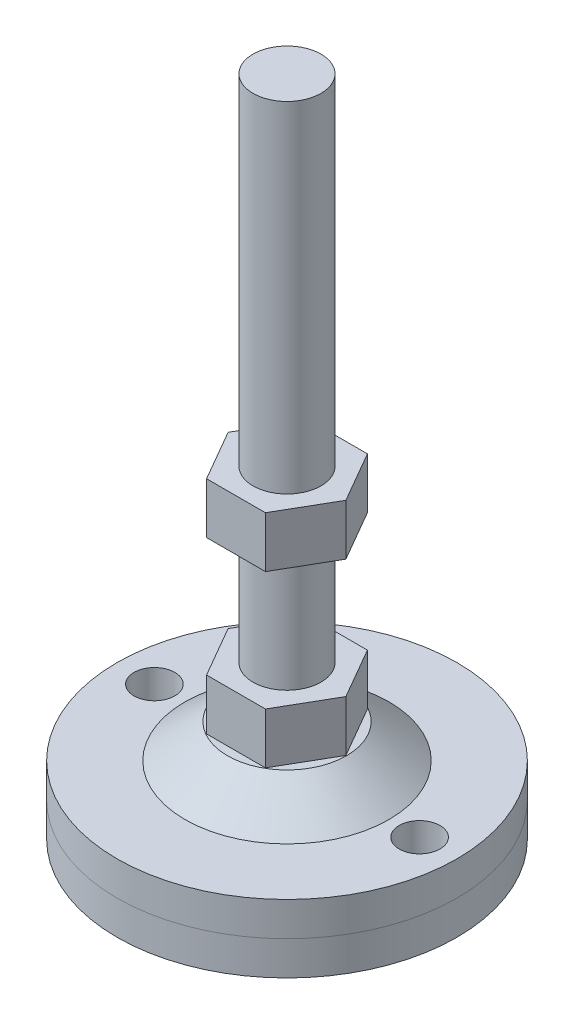
ISO-10303-21;
HEADER;
FILE_DESCRIPTION(('STEP AP214'),'2;1');
FILE_NAME('part.step','',(''),(''),'','','');
FILE_SCHEMA(('AUTOMOTIVE_DESIGN { 1 0 10303 214 1 1 1 1 }'));
ENDSEC;
DATA;
#1=APPLICATION_CONTEXT('core data for automotive mechanical design processes');
#2=APPLICATION_PROTOCOL_DEFINITION('international standard','automotive_design',2000,#1);
#3=PRODUCT_CONTEXT('',#1,'mechanical');
#4=PRODUCT('Part','Part','',(#3));
#5=PRODUCT_RELATED_PRODUCT_CATEGORY('part','',(#4));
#6=PRODUCT_DEFINITION_FORMATION('','',#4);
#7=PRODUCT_DEFINITION_CONTEXT('part definition',#1,'design');
#8=PRODUCT_DEFINITION('design','',#6,#7);
#9=PRODUCT_DEFINITION_SHAPE('','',#8);
#10=(LENGTH_UNIT() NAMED_UNIT(*) SI_UNIT(.MILLI.,.METRE.));
#11=(NAMED_UNIT(*) PLANE_ANGLE_UNIT() SI_UNIT($,.RADIAN.));
#12=(NAMED_UNIT(*) SI_UNIT($,.STERADIAN.) SOLID_ANGLE_UNIT());
#13=UNCERTAINTY_MEASURE_WITH_UNIT(LENGTH_MEASURE(1.E-05),#10,'distance_accuracy_value','');
#14=(GEOMETRIC_REPRESENTATION_CONTEXT(3) GLOBAL_UNCERTAINTY_ASSIGNED_CONTEXT((#13)) GLOBAL_UNIT_ASSIGNED_CONTEXT((#10,
#11,#12)) REPRESENTATION_CONTEXT('',''));
#15=CARTESIAN_POINT('',(0.,0.,0.));
#16=DIRECTION('',(0.,0.,1.));
#17=DIRECTION('',(1.,0.,0.));
#18=AXIS2_PLACEMENT_3D('',#15,#16,#17);
#19=CARTESIAN_POINT('',(0.,165.,0.));
#20=DIRECTION('',(0.,1.,0.));
#21=DIRECTION('',(0.,0.,1.));
#22=AXIS2_PLACEMENT_3D('',#19,#20,#21);
#23=PLANE('',#22);
#24=CARTESIAN_POINT('',(0.,165.,0.));
#25=DIRECTION('',(0.,-1.,0.));
#26=DIRECTION('',(0.,0.,-1.));
#27=AXIS2_PLACEMENT_3D('',#24,#25,#26);
#28=CIRCLE('',#27,10.);
#29=CARTESIAN_POINT('',(0.,165.,-10.));
#30=VERTEX_POINT('',#29);
#31=EDGE_CURVE('P0_E20',#30,#30,#28,.T.);
#32=ORIENTED_EDGE('',*,*,#31,.F.);
#33=EDGE_LOOP('',(#32));
#34=FACE_BOUND('',#33,.T.);
#35=ADVANCED_FACE('P0_F17',(#34),#23,.T.);
#36=CARTESIAN_POINT('',(0.,165.,0.));
#37=DIRECTION('',(0.,-1.,0.));
#38=DIRECTION('',(0.,0.,-1.));
#39=AXIS2_PLACEMENT_3D('',#36,#37,#38);
#40=CYLINDRICAL_SURFACE('',#39,10.);
#41=CARTESIAN_POINT('',(0.,65.,0.));
#42=DIRECTION('',(0.,-1.,0.));
#43=DIRECTION('',(0.,0.,-1.));
#44=AXIS2_PLACEMENT_3D('',#41,#42,#43);
#45=CIRCLE('',#44,10.);
#46=CARTESIAN_POINT('',(0.,65.,-10.));
#47=VERTEX_POINT('',#46);
#48=EDGE_CURVE('P0_E116',#47,#47,#45,.T.);
#49=ORIENTED_EDGE('',*,*,#48,.F.);
#50=EDGE_LOOP('',(#49));
#51=FACE_BOUND('',#50,.T.);
#52=ORIENTED_EDGE('',*,*,#31,.T.);
#53=EDGE_LOOP('',(#52));
#54=FACE_BOUND('',#53,.T.);
#55=ADVANCED_FACE('P0_F167',(#51,#54),#40,.T.);
#56=CARTESIAN_POINT('',(0.,65.,0.));
#57=DIRECTION('',(0.,1.,0.));
#58=DIRECTION('',(0.,0.,1.));
#59=AXIS2_PLACEMENT_3D('',#56,#57,#58);
#60=PLANE('',#59);
#61=DIRECTION('',(-0.5,0.,-0.866025403784439));
#62=VECTOR('',#61,1.);
#63=CARTESIAN_POINT('',(-17.3205080756888,65.,0.));
#64=LINE('',#63,#62);
#65=CARTESIAN_POINT('',(-17.3205080756888,65.,0.));
#66=VERTEX_POINT('',#65);
#67=CARTESIAN_POINT('',(-8.66025403784439,65.,15.));
#68=VERTEX_POINT('',#67);
#69=EDGE_CURVE('P0_E428',#66,#68,#64,.F.);
#70=ORIENTED_EDGE('',*,*,#69,.T.);
#71=DIRECTION('',(-1.,0.,0.));
#72=VECTOR('',#71,1.);
#73=CARTESIAN_POINT('',(-8.66025403784439,65.,15.));
#74=LINE('',#73,#72);
#75=CARTESIAN_POINT('',(8.66025403784439,65.,15.));
#76=VERTEX_POINT('',#75);
#77=EDGE_CURVE('P0_E435',#68,#76,#74,.F.);
#78=ORIENTED_EDGE('',*,*,#77,.T.);
#79=DIRECTION('',(-0.5,0.,0.866025403784439));
#80=VECTOR('',#79,1.);
#81=CARTESIAN_POINT('',(8.66025403784439,65.,15.));
#82=LINE('',#81,#80);
#83=CARTESIAN_POINT('',(17.3205080756888,65.,0.));
#84=VERTEX_POINT('',#83);
#85=EDGE_CURVE('P0_E112',#76,#84,#82,.F.);
#86=ORIENTED_EDGE('',*,*,#85,.T.);
#87=DIRECTION('',(0.5,0.,0.866025403784439));
#88=VECTOR('',#87,1.);
#89=CARTESIAN_POINT('',(17.3205080756888,65.,0.));
#90=LINE('',#89,#88);
#91=CARTESIAN_POINT('',(8.66025403784438,65.,-15.));
#92=VERTEX_POINT('',#91);
#93=EDGE_CURVE('P0_E107',#84,#92,#90,.F.);
#94=ORIENTED_EDGE('',*,*,#93,.T.);
#95=DIRECTION('',(1.,0.,0.));
#96=VECTOR('',#95,1.);
#97=CARTESIAN_POINT('',(8.66025403784438,65.,-15.));
#98=LINE('',#97,#96);
#99=CARTESIAN_POINT('',(-8.66025403784439,65.,-15.));
#100=VERTEX_POINT('',#99);
#101=EDGE_CURVE('P0_E104',#92,#100,#98,.F.);
#102=ORIENTED_EDGE('',*,*,#101,.T.);
#103=DIRECTION('',(0.5,0.,-0.866025403784439));
#104=VECTOR('',#103,1.);
#105=CARTESIAN_POINT('',(-8.66025403784439,65.,-15.));
#106=LINE('',#105,#104);
#107=EDGE_CURVE('P0_E130',#100,#66,#106,.F.);
#108=ORIENTED_EDGE('',*,*,#107,.T.);
#109=EDGE_LOOP('',(#70,#78,#86,#94,#102,#108));
#110=FACE_BOUND('',#109,.T.);
#111=ORIENTED_EDGE('',*,*,#48,.T.);
#112=EDGE_LOOP('',(#111));
#113=FACE_BOUND('',#112,.T.);
#114=ADVANCED_FACE('P0_F109',(#110,#113),#60,.T.);
#115=CARTESIAN_POINT('',(17.3205080756888,65.,0.));
#116=DIRECTION('',(-0.866025403784439,0.,0.5));
#117=DIRECTION('',(0.5,0.,0.866025403784439));
#118=AXIS2_PLACEMENT_3D('',#115,#116,#117);
#119=PLANE('',#118);
#120=DIRECTION('',(0.,1.,0.));
#121=VECTOR('',#120,1.);
#122=CARTESIAN_POINT('',(8.66025403784438,65.,-15.));
#123=LINE('',#122,#121);
#124=CARTESIAN_POINT('',(8.66025403784438,50.,-15.));
#125=VERTEX_POINT('',#124);
#126=EDGE_CURVE('P0_E115',#125,#92,#123,.T.);
#127=ORIENTED_EDGE('',*,*,#126,.T.);
#128=ORIENTED_EDGE('',*,*,#93,.F.);
#129=DIRECTION('',(0.,1.,0.));
#130=VECTOR('',#129,1.);
#131=CARTESIAN_POINT('',(17.3205080756888,65.,0.));
#132=LINE('',#131,#130);
#133=CARTESIAN_POINT('',(17.3205080756888,50.,0.));
#134=VERTEX_POINT('',#133);
#135=EDGE_CURVE('P0_E443',#84,#134,#132,.F.);
#136=ORIENTED_EDGE('',*,*,#135,.T.);
#137=DIRECTION('',(-0.5,0.,-0.866025403784439));
#138=VECTOR('',#137,1.);
#139=CARTESIAN_POINT('',(17.3205080756888,50.,0.));
#140=LINE('',#139,#138);
#141=EDGE_CURVE('P0_E121',#134,#125,#140,.T.);
#142=ORIENTED_EDGE('',*,*,#141,.T.);
#143=EDGE_LOOP('',(#127,#128,#136,#142));
#144=FACE_BOUND('',#143,.T.);
#145=ADVANCED_FACE('P0_F119',(#144),#119,.F.);
#146=CARTESIAN_POINT('',(8.66025403784438,65.,-15.));
#147=DIRECTION('',(0.,0.,1.));
#148=DIRECTION('',(1.,0.,0.));
#149=AXIS2_PLACEMENT_3D('',#146,#147,#148);
#150=PLANE('',#149);
#151=DIRECTION('',(0.,1.,0.));
#152=VECTOR('',#151,1.);
#153=CARTESIAN_POINT('',(-8.66025403784439,65.,-15.));
#154=LINE('',#153,#152);
#155=CARTESIAN_POINT('',(-8.66025403784439,50.,-15.));
#156=VERTEX_POINT('',#155);
#157=EDGE_CURVE('P0_E127',#156,#100,#154,.T.);
#158=ORIENTED_EDGE('',*,*,#157,.T.);
#159=ORIENTED_EDGE('',*,*,#101,.F.);
#160=ORIENTED_EDGE('',*,*,#126,.F.);
#161=DIRECTION('',(1.,0.,0.));
#162=VECTOR('',#161,1.);
#163=CARTESIAN_POINT('',(0.,50.,-15.));
#164=LINE('',#163,#162);
#165=EDGE_CURVE('P0_E446',#125,#156,#164,.F.);
#166=ORIENTED_EDGE('',*,*,#165,.T.);
#167=EDGE_LOOP('',(#158,#159,#160,#166));
#168=FACE_BOUND('',#167,.T.);
#169=ADVANCED_FACE('P0_F125',(#168),#150,.F.);
#170=CARTESIAN_POINT('',(-8.66025403784439,65.,-15.));
#171=DIRECTION('',(0.866025403784439,0.,0.5));
#172=DIRECTION('',(0.5,0.,-0.866025403784439));
#173=AXIS2_PLACEMENT_3D('',#170,#171,#172);
#174=PLANE('',#173);
#175=DIRECTION('',(0.,1.,0.));
#176=VECTOR('',#175,1.);
#177=CARTESIAN_POINT('',(-17.3205080756888,65.,0.));
#178=LINE('',#177,#176);
#179=CARTESIAN_POINT('',(-17.3205080756888,50.,0.));
#180=VERTEX_POINT('',#179);
#181=EDGE_CURVE('P0_E423',#180,#66,#178,.T.);
#182=ORIENTED_EDGE('',*,*,#181,.T.);
#183=ORIENTED_EDGE('',*,*,#107,.F.);
#184=ORIENTED_EDGE('',*,*,#157,.F.);
#185=DIRECTION('',(-0.5,0.,0.866025403784439));
#186=VECTOR('',#185,1.);
#187=CARTESIAN_POINT('',(-8.66025403784439,50.,-15.));
#188=LINE('',#187,#186);
#189=EDGE_CURVE('P0_E426',#156,#180,#188,.T.);
#190=ORIENTED_EDGE('',*,*,#189,.T.);
#191=EDGE_LOOP('',(#182,#183,#184,#190));
#192=FACE_BOUND('',#191,.T.);
#193=ADVANCED_FACE('P0_F253',(#192),#174,.F.);
#194=CARTESIAN_POINT('',(-17.3205080756888,65.,0.));
#195=DIRECTION('',(0.866025403784439,0.,-0.5));
#196=DIRECTION('',(-0.5,0.,-0.866025403784439));
#197=AXIS2_PLACEMENT_3D('',#194,#195,#196);
#198=PLANE('',#197);
#199=DIRECTION('',(0.,1.,0.));
#200=VECTOR('',#199,1.);
#201=CARTESIAN_POINT('',(-8.66025403784439,65.,15.));
#202=LINE('',#201,#200);
#203=CARTESIAN_POINT('',(-8.66025403784439,50.,15.));
#204=VERTEX_POINT('',#203);
#205=EDGE_CURVE('P0_E432',#204,#68,#202,.T.);
#206=ORIENTED_EDGE('',*,*,#205,.T.);
#207=ORIENTED_EDGE('',*,*,#69,.F.);
#208=ORIENTED_EDGE('',*,*,#181,.F.);
#209=DIRECTION('',(0.5,0.,0.866025403784439));
#210=VECTOR('',#209,1.);
#211=CARTESIAN_POINT('',(-17.3205080756888,50.,0.));
#212=LINE('',#211,#210);
#213=EDGE_CURVE('P0_E449',#180,#204,#212,.T.);
#214=ORIENTED_EDGE('',*,*,#213,.T.);
#215=EDGE_LOOP('',(#206,#207,#208,#214));
#216=FACE_BOUND('',#215,.T.);
#217=ADVANCED_FACE('P0_F249',(#216),#198,.F.);
#218=CARTESIAN_POINT('',(-8.66025403784439,65.,15.));
#219=DIRECTION('',(0.,0.,-1.));
#220=DIRECTION('',(-1.,0.,0.));
#221=AXIS2_PLACEMENT_3D('',#218,#219,#220);
#222=PLANE('',#221);
#223=DIRECTION('',(0.,1.,0.));
#224=VECTOR('',#223,1.);
#225=CARTESIAN_POINT('',(8.66025403784439,65.,15.));
#226=LINE('',#225,#224);
#227=CARTESIAN_POINT('',(8.66025403784439,50.,15.));
#228=VERTEX_POINT('',#227);
#229=EDGE_CURVE('P0_E439',#228,#76,#226,.T.);
#230=ORIENTED_EDGE('',*,*,#229,.T.);
#231=ORIENTED_EDGE('',*,*,#77,.F.);
#232=ORIENTED_EDGE('',*,*,#205,.F.);
#233=DIRECTION('',(1.,0.,0.));
#234=VECTOR('',#233,1.);
#235=CARTESIAN_POINT('',(0.,50.,15.));
#236=LINE('',#235,#234);
#237=EDGE_CURVE('P0_E451',#204,#228,#236,.T.);
#238=ORIENTED_EDGE('',*,*,#237,.T.);
#239=EDGE_LOOP('',(#230,#231,#232,#238));
#240=FACE_BOUND('',#239,.T.);
#241=ADVANCED_FACE('P0_F245',(#240),#222,.F.);
#242=CARTESIAN_POINT('',(8.66025403784439,65.,15.));
#243=DIRECTION('',(-0.866025403784439,0.,-0.5));
#244=DIRECTION('',(-0.5,0.,0.866025403784439));
#245=AXIS2_PLACEMENT_3D('',#242,#243,#244);
#246=PLANE('',#245);
#247=ORIENTED_EDGE('',*,*,#135,.F.);
#248=ORIENTED_EDGE('',*,*,#85,.F.);
#249=ORIENTED_EDGE('',*,*,#229,.F.);
#250=DIRECTION('',(0.5,0.,-0.866025403784439));
#251=VECTOR('',#250,1.);
#252=CARTESIAN_POINT('',(8.66025403784439,50.,15.));
#253=LINE('',#252,#251);
#254=EDGE_CURVE('P0_E161',#228,#134,#253,.T.);
#255=ORIENTED_EDGE('',*,*,#254,.T.);
#256=EDGE_LOOP('',(#247,#248,#249,#255));
#257=FACE_BOUND('',#256,.T.);
#258=ADVANCED_FACE('P0_F241',(#257),#246,.F.);
#259=CARTESIAN_POINT('',(0.,50.,0.));
#260=DIRECTION('',(0.,1.,0.));
#261=DIRECTION('',(0.,0.,1.));
#262=AXIS2_PLACEMENT_3D('',#259,#260,#261);
#263=PLANE('',#262);
#264=ORIENTED_EDGE('',*,*,#237,.F.);
#265=ORIENTED_EDGE('',*,*,#213,.F.);
#266=ORIENTED_EDGE('',*,*,#189,.F.);
#267=ORIENTED_EDGE('',*,*,#165,.F.);
#268=ORIENTED_EDGE('',*,*,#141,.F.);
#269=ORIENTED_EDGE('',*,*,#254,.F.);
#270=EDGE_LOOP('',(#264,#265,#266,#267,#268,#269));
#271=FACE_BOUND('',#270,.T.);
#272=CARTESIAN_POINT('',(0.,50.,0.));
#273=DIRECTION('',(0.,-1.,0.));
#274=DIRECTION('',(0.,0.,-1.));
#275=AXIS2_PLACEMENT_3D('',#272,#273,#274);
#276=CIRCLE('',#275,10.);
#277=CARTESIAN_POINT('',(0.,50.,-10.));
#278=VERTEX_POINT('',#277);
#279=EDGE_CURVE('P0_E159',#278,#278,#276,.T.);
#280=ORIENTED_EDGE('',*,*,#279,.F.);
#281=EDGE_LOOP('',(#280));
#282=FACE_BOUND('',#281,.T.);
#283=ADVANCED_FACE('P0_F237',(#271,#282),#263,.F.);
#284=CARTESIAN_POINT('',(0.,165.,0.));
#285=DIRECTION('',(0.,-1.,0.));
#286=DIRECTION('',(0.,0.,-1.));
#287=AXIS2_PLACEMENT_3D('',#284,#285,#286);
#288=CYLINDRICAL_SURFACE('',#287,10.);
#289=CARTESIAN_POINT('',(0.,15.,0.));
#290=DIRECTION('',(0.,-1.,0.));
#291=DIRECTION('',(0.,0.,-1.));
#292=AXIS2_PLACEMENT_3D('',#289,#290,#291);
#293=CIRCLE('',#292,10.);
#294=CARTESIAN_POINT('',(0.,15.,-10.));
#295=VERTEX_POINT('',#294);
#296=EDGE_CURVE('P0_E155',#295,#295,#293,.T.);
#297=ORIENTED_EDGE('',*,*,#296,.F.);
#298=EDGE_LOOP('',(#297));
#299=FACE_BOUND('',#298,.T.);
#300=ORIENTED_EDGE('',*,*,#279,.T.);
#301=EDGE_LOOP('',(#300));
#302=FACE_BOUND('',#301,.T.);
#303=ADVANCED_FACE('P0_F233',(#299,#302),#288,.T.);
#304=CARTESIAN_POINT('',(0.,15.,0.));
#305=DIRECTION('',(0.,1.,0.));
#306=DIRECTION('',(0.,0.,1.));
#307=AXIS2_PLACEMENT_3D('',#304,#305,#306);
#308=PLANE('',#307);
#309=DIRECTION('',(-0.5,0.,-0.866025403784439));
#310=VECTOR('',#309,1.);
#311=CARTESIAN_POINT('',(-17.3205080756888,15.,0.));
#312=LINE('',#311,#310);
#313=CARTESIAN_POINT('',(-17.3205080756888,15.,0.));
#314=VERTEX_POINT('',#313);
#315=CARTESIAN_POINT('',(-8.66025403784439,15.,15.));
#316=VERTEX_POINT('',#315);
#317=EDGE_CURVE('P0_E464',#314,#316,#312,.F.);
#318=ORIENTED_EDGE('',*,*,#317,.T.);
#319=DIRECTION('',(-1.,0.,0.));
#320=VECTOR('',#319,1.);
#321=CARTESIAN_POINT('',(-8.66025403784439,15.,15.));
#322=LINE('',#321,#320);
#323=CARTESIAN_POINT('',(8.66025403784439,15.,15.));
#324=VERTEX_POINT('',#323);
#325=EDGE_CURVE('P0_E460',#316,#324,#322,.F.);
#326=ORIENTED_EDGE('',*,*,#325,.T.);
#327=DIRECTION('',(-0.5,0.,0.866025403784439));
#328=VECTOR('',#327,1.);
#329=CARTESIAN_POINT('',(8.66025403784439,15.,15.));
#330=LINE('',#329,#328);
#331=CARTESIAN_POINT('',(17.3205080756888,15.,0.));
#332=VERTEX_POINT('',#331);
#333=EDGE_CURVE('P0_E456',#324,#332,#330,.F.);
#334=ORIENTED_EDGE('',*,*,#333,.T.);
#335=DIRECTION('',(0.5,0.,0.866025403784439));
#336=VECTOR('',#335,1.);
#337=CARTESIAN_POINT('',(17.3205080756888,15.,0.));
#338=LINE('',#337,#336);
#339=CARTESIAN_POINT('',(8.66025403784438,15.,-15.));
#340=VERTEX_POINT('',#339);
#341=EDGE_CURVE('P0_E158',#332,#340,#338,.F.);
#342=ORIENTED_EDGE('',*,*,#341,.T.);
#343=DIRECTION('',(1.,0.,0.));
#344=VECTOR('',#343,1.);
#345=CARTESIAN_POINT('',(8.66025403784438,15.,-15.));
#346=LINE('',#345,#344);
#347=CARTESIAN_POINT('',(-8.66025403784439,15.,-15.));
#348=VERTEX_POINT('',#347);
#349=EDGE_CURVE('P0_E475',#340,#348,#346,.F.);
#350=ORIENTED_EDGE('',*,*,#349,.T.);
#351=DIRECTION('',(0.5,0.,-0.866025403784439));
#352=VECTOR('',#351,1.);
#353=CARTESIAN_POINT('',(-8.66025403784439,15.,-15.));
#354=LINE('',#353,#352);
#355=EDGE_CURVE('P0_E468',#348,#314,#354,.F.);
#356=ORIENTED_EDGE('',*,*,#355,.T.);
#357=EDGE_LOOP('',(#318,#326,#334,#342,#350,#356));
#358=FACE_BOUND('',#357,.T.);
#359=ORIENTED_EDGE('',*,*,#296,.T.);
#360=EDGE_LOOP('',(#359));
#361=FACE_BOUND('',#360,.T.);
#362=ADVANCED_FACE('P0_F229',(#358,#361),#308,.T.);
#363=CARTESIAN_POINT('',(17.3205080756888,15.,0.));
#364=DIRECTION('',(-0.866025403784439,0.,0.5));
#365=DIRECTION('',(0.5,0.,0.866025403784439));
#366=AXIS2_PLACEMENT_3D('',#363,#364,#365);
#367=PLANE('',#366);
#368=DIRECTION('',(0.,1.,0.));
#369=VECTOR('',#368,1.);
#370=CARTESIAN_POINT('',(8.66025403784438,15.,-15.));
#371=LINE('',#370,#369);
#372=CARTESIAN_POINT('',(8.66025403784438,0.,-15.));
#373=VERTEX_POINT('',#372);
#374=EDGE_CURVE('P0_E472',#373,#340,#371,.T.);
#375=ORIENTED_EDGE('',*,*,#374,.T.);
#376=ORIENTED_EDGE('',*,*,#341,.F.);
#377=DIRECTION('',(0.,1.,0.));
#378=VECTOR('',#377,1.);
#379=CARTESIAN_POINT('',(17.3205080756888,15.,0.));
#380=LINE('',#379,#378);
#381=CARTESIAN_POINT('',(17.3205080756888,0.,0.));
#382=VERTEX_POINT('',#381);
#383=EDGE_CURVE('P0_E458',#332,#382,#380,.F.);
#384=ORIENTED_EDGE('',*,*,#383,.T.);
#385=DIRECTION('',(0.5,0.,0.866025403784439));
#386=VECTOR('',#385,1.);
#387=CARTESIAN_POINT('',(8.66025403784438,0.,-15.));
#388=LINE('',#387,#386);
#389=EDGE_CURVE('P0_E478',#373,#382,#388,.T.);
#390=ORIENTED_EDGE('',*,*,#389,.F.);
#391=EDGE_LOOP('',(#375,#376,#384,#390));
#392=FACE_BOUND('',#391,.T.);
#393=ADVANCED_FACE('P0_F225',(#392),#367,.F.);
#394=CARTESIAN_POINT('',(8.66025403784439,15.,15.));
#395=DIRECTION('',(-0.866025403784439,0.,-0.5));
#396=DIRECTION('',(-0.5,0.,0.866025403784439));
#397=AXIS2_PLACEMENT_3D('',#394,#395,#396);
#398=PLANE('',#397);
#399=ORIENTED_EDGE('',*,*,#383,.F.);
#400=ORIENTED_EDGE('',*,*,#333,.F.);
#401=DIRECTION('',(0.,1.,0.));
#402=VECTOR('',#401,1.);
#403=CARTESIAN_POINT('',(8.66025403784439,15.,15.));
#404=LINE('',#403,#402);
#405=CARTESIAN_POINT('',(8.66025403784439,0.,15.));
#406=VERTEX_POINT('',#405);
#407=EDGE_CURVE('P0_E462',#324,#406,#404,.F.);
#408=ORIENTED_EDGE('',*,*,#407,.T.);
#409=DIRECTION('',(-0.5,0.,0.866025403784439));
#410=VECTOR('',#409,1.);
#411=CARTESIAN_POINT('',(17.3205080756888,0.,0.));
#412=LINE('',#411,#410);
#413=EDGE_CURVE('P0_E481',#382,#406,#412,.T.);
#414=ORIENTED_EDGE('',*,*,#413,.F.);
#415=EDGE_LOOP('',(#399,#400,#408,#414));
#416=FACE_BOUND('',#415,.T.);
#417=ADVANCED_FACE('P0_F221',(#416),#398,.F.);
#418=CARTESIAN_POINT('',(-8.66025403784439,15.,15.));
#419=DIRECTION('',(0.,0.,-1.));
#420=DIRECTION('',(-1.,0.,0.));
#421=AXIS2_PLACEMENT_3D('',#418,#419,#420);
#422=PLANE('',#421);
#423=ORIENTED_EDGE('',*,*,#407,.F.);
#424=ORIENTED_EDGE('',*,*,#325,.F.);
#425=DIRECTION('',(0.,1.,0.));
#426=VECTOR('',#425,1.);
#427=CARTESIAN_POINT('',(-8.6602540378444,15.,15.));
#428=LINE('',#427,#426);
#429=CARTESIAN_POINT('',(-8.66025403784439,0.,15.));
#430=VERTEX_POINT('',#429);
#431=EDGE_CURVE('P0_E466',#316,#430,#428,.F.);
#432=ORIENTED_EDGE('',*,*,#431,.T.);
#433=DIRECTION('',(1.,0.,0.));
#434=VECTOR('',#433,1.);
#435=CARTESIAN_POINT('',(0.,0.,15.));
#436=LINE('',#435,#434);
#437=EDGE_CURVE('P0_E484',#406,#430,#436,.F.);
#438=ORIENTED_EDGE('',*,*,#437,.F.);
#439=EDGE_LOOP('',(#423,#424,#432,#438));
#440=FACE_BOUND('',#439,.T.);
#441=ADVANCED_FACE('P0_F217',(#440),#422,.F.);
#442=CARTESIAN_POINT('',(-17.3205080756888,15.,0.));
#443=DIRECTION('',(0.866025403784439,0.,-0.5));
#444=DIRECTION('',(-0.5,0.,-0.866025403784439));
#445=AXIS2_PLACEMENT_3D('',#442,#443,#444);
#446=PLANE('',#445);
#447=ORIENTED_EDGE('',*,*,#431,.F.);
#448=ORIENTED_EDGE('',*,*,#317,.F.);
#449=DIRECTION('',(0.,1.,0.));
#450=VECTOR('',#449,1.);
#451=CARTESIAN_POINT('',(-17.3205080756888,15.,0.));
#452=LINE('',#451,#450);
#453=CARTESIAN_POINT('',(-17.3205080756888,0.,0.));
#454=VERTEX_POINT('',#453);
#455=EDGE_CURVE('P0_E470',#314,#454,#452,.F.);
#456=ORIENTED_EDGE('',*,*,#455,.T.);
#457=DIRECTION('',(-0.5,0.,-0.866025403784439));
#458=VECTOR('',#457,1.);
#459=CARTESIAN_POINT('',(-8.66025403784439,0.,15.));
#460=LINE('',#459,#458);
#461=EDGE_CURVE('P0_E487',#430,#454,#460,.T.);
#462=ORIENTED_EDGE('',*,*,#461,.F.);
#463=EDGE_LOOP('',(#447,#448,#456,#462));
#464=FACE_BOUND('',#463,.T.);
#465=ADVANCED_FACE('P0_F214',(#464),#446,.F.);
#466=CARTESIAN_POINT('',(-8.66025403784439,15.,-15.));
#467=DIRECTION('',(0.866025403784439,0.,0.5));
#468=DIRECTION('',(0.5,0.,-0.866025403784439));
#469=AXIS2_PLACEMENT_3D('',#466,#467,#468);
#470=PLANE('',#469);
#471=ORIENTED_EDGE('',*,*,#455,.F.);
#472=ORIENTED_EDGE('',*,*,#355,.F.);
#473=DIRECTION('',(0.,1.,0.));
#474=VECTOR('',#473,1.);
#475=CARTESIAN_POINT('',(-8.66025403784439,15.,-15.));
#476=LINE('',#475,#474);
#477=CARTESIAN_POINT('',(-8.66025403784439,0.,-15.));
#478=VERTEX_POINT('',#477);
#479=EDGE_CURVE('P0_E35',#348,#478,#476,.F.);
#480=ORIENTED_EDGE('',*,*,#479,.T.);
#481=DIRECTION('',(0.5,0.,-0.866025403784439));
#482=VECTOR('',#481,1.);
#483=CARTESIAN_POINT('',(-17.3205080756888,0.,0.));
#484=LINE('',#483,#482);
#485=EDGE_CURVE('P0_E490',#454,#478,#484,.T.);
#486=ORIENTED_EDGE('',*,*,#485,.F.);
#487=EDGE_LOOP('',(#471,#472,#480,#486));
#488=FACE_BOUND('',#487,.T.);
#489=ADVANCED_FACE('P0_F210',(#488),#470,.F.);
#490=CARTESIAN_POINT('',(8.66025403784438,15.,-15.));
#491=DIRECTION('',(0.,0.,1.));
#492=DIRECTION('',(1.,0.,0.));
#493=AXIS2_PLACEMENT_3D('',#490,#491,#492);
#494=PLANE('',#493);
#495=ORIENTED_EDGE('',*,*,#479,.F.);
#496=ORIENTED_EDGE('',*,*,#349,.F.);
#497=ORIENTED_EDGE('',*,*,#374,.F.);
#498=DIRECTION('',(1.,0.,0.));
#499=VECTOR('',#498,1.);
#500=CARTESIAN_POINT('',(0.,0.,-15.));
#501=LINE('',#500,#499);
#502=EDGE_CURVE('P0_E154',#478,#373,#501,.T.);
#503=ORIENTED_EDGE('',*,*,#502,.F.);
#504=EDGE_LOOP('',(#495,#496,#497,#503));
#505=FACE_BOUND('',#504,.T.);
#506=ADVANCED_FACE('P0_F206',(#505),#494,.F.);
#507=CARTESIAN_POINT('',(0.,0.,0.));
#508=DIRECTION('',(0.,1.,0.));
#509=DIRECTION('',(0.,0.,1.));
#510=AXIS2_PLACEMENT_3D('',#507,#508,#509);
#511=PLANE('',#510);
#512=ORIENTED_EDGE('',*,*,#485,.T.);
#513=ORIENTED_EDGE('',*,*,#502,.T.);
#514=ORIENTED_EDGE('',*,*,#389,.T.);
#515=ORIENTED_EDGE('',*,*,#413,.T.);
#516=ORIENTED_EDGE('',*,*,#437,.T.);
#517=ORIENTED_EDGE('',*,*,#461,.T.);
#518=EDGE_LOOP('',(#512,#513,#514,#515,#516,#517));
#519=FACE_BOUND('',#518,.T.);
#520=CARTESIAN_POINT('',(0.,0.,0.));
#521=DIRECTION('',(0.,-1.,0.));
#522=DIRECTION('',(1.,0.,0.));
#523=AXIS2_PLACEMENT_3D('',#520,#521,#522);
#524=CIRCLE('',#523,17.5);
#525=CARTESIAN_POINT('',(17.5,0.,0.));
#526=VERTEX_POINT('',#525);
#527=EDGE_CURVE('P0_E151',#526,#526,#524,.T.);
#528=ORIENTED_EDGE('',*,*,#527,.F.);
#529=EDGE_LOOP('',(#528));
#530=FACE_BOUND('',#529,.T.);
#531=ADVANCED_FACE('P0_F202',(#519,#530),#511,.T.);
#532=CARTESIAN_POINT('',(0.,-10.,0.));
#533=DIRECTION('',(0.,-1.,0.));
#534=DIRECTION('',(1.,0.,0.));
#535=AXIS2_PLACEMENT_3D('',#532,#533,#534);
#536=CONICAL_SURFACE('',#535,30.,0.896055384571344);
#537=ORIENTED_EDGE('',*,*,#527,.T.);
#538=EDGE_LOOP('',(#537));
#539=FACE_BOUND('',#538,.T.);
#540=CARTESIAN_POINT('',(0.,-10.,0.));
#541=DIRECTION('',(0.,-1.,0.));
#542=DIRECTION('',(1.,0.,0.));
#543=AXIS2_PLACEMENT_3D('',#540,#541,#542);
#544=CIRCLE('',#543,30.);
#545=CARTESIAN_POINT('',(30.,-10.,0.));
#546=VERTEX_POINT('',#545);
#547=EDGE_CURVE('P0_E148',#546,#546,#544,.T.);
#548=ORIENTED_EDGE('',*,*,#547,.F.);
#549=EDGE_LOOP('',(#548));
#550=FACE_BOUND('',#549,.T.);
#551=ADVANCED_FACE('P0_F198',(#539,#550),#536,.T.);
#552=CARTESIAN_POINT('',(0.,-10.,-30.));
#553=DIRECTION('',(0.,1.,0.));
#554=DIRECTION('',(0.,0.,1.));
#555=AXIS2_PLACEMENT_3D('',#552,#553,#554);
#556=PLANE('',#555);
#557=CARTESIAN_POINT('',(0.,-10.,0.));
#558=DIRECTION('',(0.,-1.,0.));
#559=DIRECTION('',(0.,0.,-1.));
#560=AXIS2_PLACEMENT_3D('',#557,#558,#559);
#561=CIRCLE('',#560,50.);
#562=CARTESIAN_POINT('',(0.,-10.,-50.));
#563=VERTEX_POINT('',#562);
#564=EDGE_CURVE('P0_E139',#563,#563,#561,.T.);
#565=ORIENTED_EDGE('',*,*,#564,.F.);
#566=EDGE_LOOP('',(#565));
#567=FACE_BOUND('',#566,.T.);
#568=ORIENTED_EDGE('',*,*,#547,.T.);
#569=EDGE_LOOP('',(#568));
#570=FACE_BOUND('',#569,.T.);
#571=CARTESIAN_POINT('',(-39.,-10.,0.));
#572=DIRECTION('',(0.,1.,0.));
#573=DIRECTION('',(0.,0.,1.));
#574=AXIS2_PLACEMENT_3D('',#571,#572,#573);
#575=CIRCLE('',#574,5.99999999999999);
#576=CARTESIAN_POINT('',(-39.,-10.,5.99999999999999));
#577=VERTEX_POINT('',#576);
#578=EDGE_CURVE('P0_E142',#577,#577,#575,.F.);
#579=ORIENTED_EDGE('',*,*,#578,.T.);
#580=EDGE_LOOP('',(#579));
#581=FACE_BOUND('',#580,.T.);
#582=CARTESIAN_POINT('',(39.,-10.,0.));
#583=DIRECTION('',(0.,1.,0.));
#584=DIRECTION('',(0.,0.,1.));
#585=AXIS2_PLACEMENT_3D('',#582,#583,#584);
#586=CIRCLE('',#585,5.99999999999999);
#587=CARTESIAN_POINT('',(39.,-10.,5.99999999999999));
#588=VERTEX_POINT('',#587);
#589=EDGE_CURVE('P0_E145',#588,#588,#586,.F.);
#590=ORIENTED_EDGE('',*,*,#589,.T.);
#591=EDGE_LOOP('',(#590));
#592=FACE_BOUND('',#591,.T.);
#593=ADVANCED_FACE('P0_F194',(#567,#570,#581,#592),#556,.T.);
#594=CARTESIAN_POINT('',(39.,-20.,0.));
#595=DIRECTION('',(0.,1.,0.));
#596=DIRECTION('',(0.,0.,1.));
#597=AXIS2_PLACEMENT_3D('',#594,#595,#596);
#598=CYLINDRICAL_SURFACE('',#597,5.99999999999999);
#599=ORIENTED_EDGE('',*,*,#589,.F.);
#600=EDGE_LOOP('',(#599));
#601=FACE_BOUND('',#600,.T.);
#602=CARTESIAN_POINT('',(39.,-20.,0.));
#603=DIRECTION('',(0.,1.,0.));
#604=DIRECTION('',(0.,0.,1.));
#605=AXIS2_PLACEMENT_3D('',#602,#603,#604);
#606=CIRCLE('',#605,5.99999999999999);
#607=CARTESIAN_POINT('',(39.,-20.,5.99999999999999));
#608=VERTEX_POINT('',#607);
#609=EDGE_CURVE('P0_E136',#608,#608,#606,.T.);
#610=ORIENTED_EDGE('',*,*,#609,.F.);
#611=EDGE_LOOP('',(#610));
#612=FACE_BOUND('',#611,.T.);
#613=ADVANCED_FACE('P0_F190',(#601,#612),#598,.F.);
#614=CARTESIAN_POINT('',(-39.,-20.,0.));
#615=DIRECTION('',(0.,1.,0.));
#616=DIRECTION('',(0.,0.,1.));
#617=AXIS2_PLACEMENT_3D('',#614,#615,#616);
#618=CYLINDRICAL_SURFACE('',#617,5.99999999999999);
#619=ORIENTED_EDGE('',*,*,#578,.F.);
#620=EDGE_LOOP('',(#619));
#621=FACE_BOUND('',#620,.T.);
#622=CARTESIAN_POINT('',(-39.,-20.,0.));
#623=DIRECTION('',(0.,1.,0.));
#624=DIRECTION('',(0.,0.,1.));
#625=AXIS2_PLACEMENT_3D('',#622,#623,#624);
#626=CIRCLE('',#625,5.99999999999999);
#627=CARTESIAN_POINT('',(-39.,-20.,5.99999999999999));
#628=VERTEX_POINT('',#627);
#629=EDGE_CURVE('P0_E26',#628,#628,#626,.T.);
#630=ORIENTED_EDGE('',*,*,#629,.F.);
#631=EDGE_LOOP('',(#630));
#632=FACE_BOUND('',#631,.T.);
#633=ADVANCED_FACE('P0_F183',(#621,#632),#618,.F.);
#634=CARTESIAN_POINT('',(0.,0.,0.));
#635=DIRECTION('',(0.,-1.,0.));
#636=DIRECTION('',(0.,0.,-1.));
#637=AXIS2_PLACEMENT_3D('',#634,#635,#636);
#638=CYLINDRICAL_SURFACE('',#637,50.);
#639=ORIENTED_EDGE('',*,*,#564,.T.);
#640=EDGE_LOOP('',(#639));
#641=FACE_BOUND('',#640,.T.);
#642=CARTESIAN_POINT('',(0.,-20.,0.));
#643=DIRECTION('',(0.,-1.,0.));
#644=DIRECTION('',(0.,0.,-1.));
#645=AXIS2_PLACEMENT_3D('',#642,#643,#644);
#646=CIRCLE('',#645,50.);
#647=CARTESIAN_POINT('',(0.,-20.,-50.));
#648=VERTEX_POINT('',#647);
#649=EDGE_CURVE('P0_E11',#648,#648,#646,.T.);
#650=ORIENTED_EDGE('',*,*,#649,.F.);
#651=EDGE_LOOP('',(#650));
#652=FACE_BOUND('',#651,.T.);
#653=ADVANCED_FACE('P0_F177',(#641,#652),#638,.T.);
#654=CARTESIAN_POINT('',(0.,-20.,-50.));
#655=DIRECTION('',(0.,-1.,0.));
#656=DIRECTION('',(0.,0.,-1.));
#657=AXIS2_PLACEMENT_3D('',#654,#655,#656);
#658=PLANE('',#657);
#659=ORIENTED_EDGE('',*,*,#649,.T.);
#660=EDGE_LOOP('',(#659));
#661=FACE_BOUND('',#660,.T.);
#662=ORIENTED_EDGE('',*,*,#629,.T.);
#663=EDGE_LOOP('',(#662));
#664=FACE_BOUND('',#663,.T.);
#665=ORIENTED_EDGE('',*,*,#609,.T.);
#666=EDGE_LOOP('',(#665));
#667=FACE_BOUND('',#666,.T.);
#668=ADVANCED_FACE('P0_F175',(#661,#664,#667),#658,.T.);
#669=CLOSED_SHELL('',(#35,#55,#114,#145,#169,#193,#217,#241,#258,#283,#303,#362,#393,#417,#441,
#465,#489,#506,#531,#551,#593,#613,#633,#653,#668));
#670=MANIFOLD_SOLID_BREP('P0_B1',#669);
#671=CARTESIAN_POINT('',(0.,-20.,0.));
#672=DIRECTION('',(0.,-1.,0.));
#673=DIRECTION('',(0.,0.,-1.));
#674=AXIS2_PLACEMENT_3D('',#671,#672,#673);
#675=PLANE('',#674);
#676=CARTESIAN_POINT('',(39.,-20.,0.));
#677=DIRECTION('',(0.,1.,0.));
#678=DIRECTION('',(0.,0.,1.));
#679=AXIS2_PLACEMENT_3D('',#676,#677,#678);
#680=CIRCLE('',#679,5.99999999999999);
#681=CARTESIAN_POINT('',(39.,-20.,5.99999999999999));
#682=VERTEX_POINT('',#681);
#683=EDGE_CURVE('P1_E32',#682,#682,#680,.F.);
#684=ORIENTED_EDGE('',*,*,#683,.T.);
#685=EDGE_LOOP('',(#684));
#686=FACE_BOUND('',#685,.T.);
#687=CARTESIAN_POINT('',(-39.,-20.,0.));
#688=DIRECTION('',(0.,1.,0.));
#689=DIRECTION('',(0.,0.,1.));
#690=AXIS2_PLACEMENT_3D('',#687,#688,#689);
#691=CIRCLE('',#690,5.99999999999999);
#692=CARTESIAN_POINT('',(-39.,-20.,5.99999999999999));
#693=VERTEX_POINT('',#692);
#694=EDGE_CURVE('P1_E18',#693,#693,#691,.F.);
#695=ORIENTED_EDGE('',*,*,#694,.T.);
#696=EDGE_LOOP('',(#695));
#697=FACE_BOUND('',#696,.T.);
#698=CARTESIAN_POINT('',(0.,-20.,0.));
#699=DIRECTION('',(0.,1.,0.));
#700=DIRECTION('',(0.,0.,1.));
#701=AXIS2_PLACEMENT_3D('',#698,#699,#700);
#702=CIRCLE('',#701,50.);
#703=CARTESIAN_POINT('',(0.,-20.,50.));
#704=VERTEX_POINT('',#703);
#705=EDGE_CURVE('P1_E34',#704,#704,#702,.F.);
#706=ORIENTED_EDGE('',*,*,#705,.F.);
#707=EDGE_LOOP('',(#706));
#708=FACE_BOUND('',#707,.T.);
#709=ADVANCED_FACE('P1_F15',(#686,#697,#708),#675,.F.);
#710=CARTESIAN_POINT('',(-39.,-30.,0.));
#711=DIRECTION('',(0.,1.,0.));
#712=DIRECTION('',(0.,0.,1.));
#713=AXIS2_PLACEMENT_3D('',#710,#711,#712);
#714=CYLINDRICAL_SURFACE('',#713,5.99999999999999);
#715=CARTESIAN_POINT('',(-39.,-30.,0.));
#716=DIRECTION('',(0.,1.,0.));
#717=DIRECTION('',(0.,0.,1.));
#718=AXIS2_PLACEMENT_3D('',#715,#716,#717);
#719=CIRCLE('',#718,5.99999999999999);
#720=CARTESIAN_POINT('',(-39.,-30.,5.99999999999999));
#721=VERTEX_POINT('',#720);
#722=EDGE_CURVE('P1_E27',#721,#721,#719,.T.);
#723=ORIENTED_EDGE('',*,*,#722,.F.);
#724=EDGE_LOOP('',(#723));
#725=FACE_BOUND('',#724,.T.);
#726=ORIENTED_EDGE('',*,*,#694,.F.);
#727=EDGE_LOOP('',(#726));
#728=FACE_BOUND('',#727,.T.);
#729=ADVANCED_FACE('P1_F43',(#725,#728),#714,.F.);
#730=CARTESIAN_POINT('',(0.,-30.,0.));
#731=DIRECTION('',(0.,1.,0.));
#732=DIRECTION('',(0.,0.,1.));
#733=AXIS2_PLACEMENT_3D('',#730,#731,#732);
#734=CYLINDRICAL_SURFACE('',#733,50.);
#735=ORIENTED_EDGE('',*,*,#705,.T.);
#736=EDGE_LOOP('',(#735));
#737=FACE_BOUND('',#736,.T.);
#738=CARTESIAN_POINT('',(0.,-30.,0.));
#739=DIRECTION('',(0.,1.,0.));
#740=DIRECTION('',(0.,0.,1.));
#741=AXIS2_PLACEMENT_3D('',#738,#739,#740);
#742=CIRCLE('',#741,50.);
#743=CARTESIAN_POINT('',(0.,-30.,50.));
#744=VERTEX_POINT('',#743);
#745=EDGE_CURVE('P1_E22',#744,#744,#742,.F.);
#746=ORIENTED_EDGE('',*,*,#745,.F.);
#747=EDGE_LOOP('',(#746));
#748=FACE_BOUND('',#747,.T.);
#749=ADVANCED_FACE('P1_F45',(#737,#748),#734,.T.);
#750=CARTESIAN_POINT('',(39.,-30.,0.));
#751=DIRECTION('',(0.,1.,0.));
#752=DIRECTION('',(0.,0.,1.));
#753=AXIS2_PLACEMENT_3D('',#750,#751,#752);
#754=CYLINDRICAL_SURFACE('',#753,5.99999999999999);
#755=CARTESIAN_POINT('',(39.,-30.,0.));
#756=DIRECTION('',(0.,1.,0.));
#757=DIRECTION('',(0.,0.,1.));
#758=AXIS2_PLACEMENT_3D('',#755,#756,#757);
#759=CIRCLE('',#758,5.99999999999999);
#760=CARTESIAN_POINT('',(39.,-30.,5.99999999999999));
#761=VERTEX_POINT('',#760);
#762=EDGE_CURVE('P1_E10',#761,#761,#759,.T.);
#763=ORIENTED_EDGE('',*,*,#762,.F.);
#764=EDGE_LOOP('',(#763));
#765=FACE_BOUND('',#764,.T.);
#766=ORIENTED_EDGE('',*,*,#683,.F.);
#767=EDGE_LOOP('',(#766));
#768=FACE_BOUND('',#767,.T.);
#769=ADVANCED_FACE('P1_F52',(#765,#768),#754,.F.);
#770=CARTESIAN_POINT('',(0.,-30.,0.));
#771=DIRECTION('',(0.,-1.,0.));
#772=DIRECTION('',(0.,0.,-1.));
#773=AXIS2_PLACEMENT_3D('',#770,#771,#772);
#774=PLANE('',#773);
#775=ORIENTED_EDGE('',*,*,#762,.T.);
#776=EDGE_LOOP('',(#775));
#777=FACE_BOUND('',#776,.T.);
#778=ORIENTED_EDGE('',*,*,#745,.T.);
#779=EDGE_LOOP('',(#778));
#780=FACE_BOUND('',#779,.T.);
#781=ORIENTED_EDGE('',*,*,#722,.T.);
#782=EDGE_LOOP('',(#781));
#783=FACE_BOUND('',#782,.T.);
#784=ADVANCED_FACE('P1_F56',(#777,#780,#783),#774,.T.);
#785=CLOSED_SHELL('',(#709,#729,#749,#769,#784));
#786=MANIFOLD_SOLID_BREP('P1_B1',#785);
#787=ADVANCED_BREP_SHAPE_REPRESENTATION('',(#18,#670,#786),#14);
#788=SHAPE_DEFINITION_REPRESENTATION(#9,#787);
ENDSEC;
END-ISO-10303-21;
